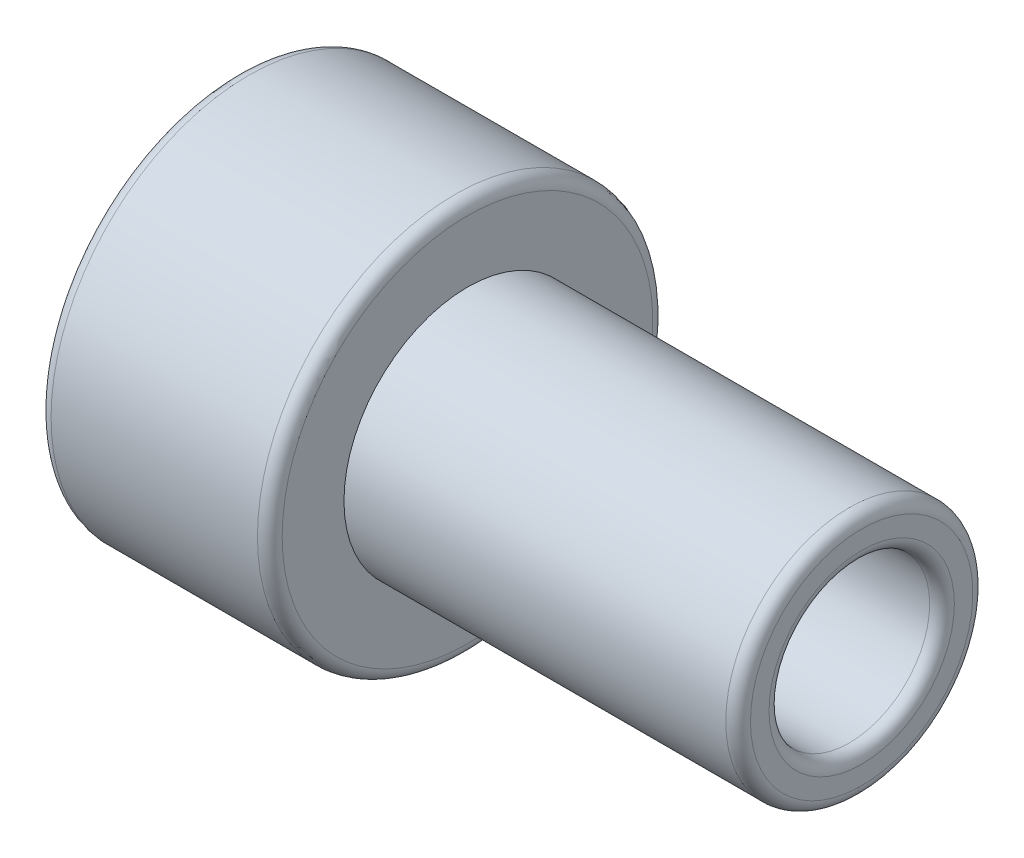
ISO-10303-21;
HEADER;
FILE_DESCRIPTION(('STEP AP214'),'2;1');
FILE_NAME('part.step','',(''),(''),'','','');
FILE_SCHEMA(('AUTOMOTIVE_DESIGN { 1 0 10303 214 1 1 1 1 }'));
ENDSEC;
DATA;
#1=APPLICATION_CONTEXT('core data for automotive mechanical design processes');
#2=APPLICATION_PROTOCOL_DEFINITION('international standard','automotive_design',2000,#1);
#3=PRODUCT_CONTEXT('',#1,'mechanical');
#4=PRODUCT('Part','Part','',(#3));
#5=PRODUCT_RELATED_PRODUCT_CATEGORY('part','',(#4));
#6=PRODUCT_DEFINITION_FORMATION('','',#4);
#7=PRODUCT_DEFINITION_CONTEXT('part definition',#1,'design');
#8=PRODUCT_DEFINITION('design','',#6,#7);
#9=PRODUCT_DEFINITION_SHAPE('','',#8);
#10=(LENGTH_UNIT() NAMED_UNIT(*) SI_UNIT(.MILLI.,.METRE.));
#11=(NAMED_UNIT(*) PLANE_ANGLE_UNIT() SI_UNIT($,.RADIAN.));
#12=(NAMED_UNIT(*) SI_UNIT($,.STERADIAN.) SOLID_ANGLE_UNIT());
#13=UNCERTAINTY_MEASURE_WITH_UNIT(LENGTH_MEASURE(1.E-05),#10,'distance_accuracy_value','');
#14=(GEOMETRIC_REPRESENTATION_CONTEXT(3) GLOBAL_UNCERTAINTY_ASSIGNED_CONTEXT((#13)) GLOBAL_UNIT_ASSIGNED_CONTEXT((#10,
#11,#12)) REPRESENTATION_CONTEXT('',''));
#15=CARTESIAN_POINT('',(0.,0.,0.));
#16=DIRECTION('',(0.,0.,1.));
#17=DIRECTION('',(1.,0.,0.));
#18=AXIS2_PLACEMENT_3D('',#15,#16,#17);
#19=CARTESIAN_POINT('',(11.3,0.,0.));
#20=DIRECTION('',(-1.,0.,0.));
#21=DIRECTION('',(0.,0.,1.));
#22=AXIS2_PLACEMENT_3D('',#19,#20,#21);
#23=PLANE('',#22);
#24=CARTESIAN_POINT('',(11.3,0.,0.));
#25=DIRECTION('',(-1.,0.,0.));
#26=DIRECTION('',(0.,0.,1.));
#27=AXIS2_PLACEMENT_3D('',#24,#25,#26);
#28=CIRCLE('',#27,4.5);
#29=CARTESIAN_POINT('',(11.3,0.,4.5));
#30=VERTEX_POINT('',#29);
#31=EDGE_CURVE('E62',#30,#30,#28,.F.);
#32=ORIENTED_EDGE('',*,*,#31,.T.);
#33=EDGE_LOOP('',(#32));
#34=FACE_BOUND('',#33,.T.);
#35=CARTESIAN_POINT('',(11.3,0.,0.));
#36=DIRECTION('',(-1.,0.,0.));
#37=DIRECTION('',(0.,0.,1.));
#38=AXIS2_PLACEMENT_3D('',#35,#36,#37);
#39=CIRCLE('',#38,3.75);
#40=CARTESIAN_POINT('',(11.3,0.,3.75));
#41=VERTEX_POINT('',#40);
#42=EDGE_CURVE('E65',#41,#41,#39,.T.);
#43=ORIENTED_EDGE('',*,*,#42,.T.);
#44=EDGE_LOOP('',(#43));
#45=FACE_BOUND('',#44,.T.);
#46=ADVANCED_FACE('F33',(#34,#45),#23,.F.);
#47=CARTESIAN_POINT('',(-1.17432348671967,0.,0.));
#48=DIRECTION('',(-1.,0.,0.));
#49=DIRECTION('',(0.,0.,1.));
#50=AXIS2_PLACEMENT_3D('',#47,#48,#49);
#51=CYLINDRICAL_SURFACE('',#50,5.);
#52=CARTESIAN_POINT('',(10.8,0.,0.));
#53=DIRECTION('',(-1.,0.,0.));
#54=DIRECTION('',(0.,0.,1.));
#55=AXIS2_PLACEMENT_3D('',#52,#53,#54);
#56=CIRCLE('',#55,5.);
#57=CARTESIAN_POINT('',(10.8,0.,5.));
#58=VERTEX_POINT('',#57);
#59=EDGE_CURVE('E68',#58,#58,#56,.T.);
#60=ORIENTED_EDGE('',*,*,#59,.T.);
#61=EDGE_LOOP('',(#60));
#62=FACE_BOUND('',#61,.T.);
#63=CARTESIAN_POINT('',(-4.65,0.,0.));
#64=DIRECTION('',(-1.,0.,0.));
#65=DIRECTION('',(0.,0.,1.));
#66=AXIS2_PLACEMENT_3D('',#63,#64,#65);
#67=CIRCLE('',#66,5.);
#68=CARTESIAN_POINT('',(-4.65,0.,5.));
#69=VERTEX_POINT('',#68);
#70=EDGE_CURVE('E71',#69,#69,#67,.T.);
#71=ORIENTED_EDGE('',*,*,#70,.F.);
#72=EDGE_LOOP('',(#71));
#73=FACE_BOUND('',#72,.T.);
#74=ADVANCED_FACE('F77',(#62,#73),#51,.T.);
#75=CARTESIAN_POINT('',(-4.65,0.,0.));
#76=DIRECTION('',(-1.,0.,0.));
#77=DIRECTION('',(0.,0.,1.));
#78=AXIS2_PLACEMENT_3D('',#75,#76,#77);
#79=PLANE('',#78);
#80=CARTESIAN_POINT('',(-4.65,0.,0.));
#81=DIRECTION('',(-1.,0.,0.));
#82=DIRECTION('',(0.,0.,1.));
#83=AXIS2_PLACEMENT_3D('',#80,#81,#82);
#84=CIRCLE('',#83,7.5);
#85=CARTESIAN_POINT('',(-4.65,0.,7.5));
#86=VERTEX_POINT('',#85);
#87=EDGE_CURVE('E44',#86,#86,#84,.F.);
#88=ORIENTED_EDGE('',*,*,#87,.T.);
#89=EDGE_LOOP('',(#88));
#90=FACE_BOUND('',#89,.T.);
#91=ORIENTED_EDGE('',*,*,#70,.T.);
#92=EDGE_LOOP('',(#91));
#93=FACE_BOUND('',#92,.T.);
#94=ADVANCED_FACE('F75',(#90,#93),#79,.F.);
#95=CARTESIAN_POINT('',(-1.17432348671967,0.,0.));
#96=DIRECTION('',(-1.,0.,0.));
#97=DIRECTION('',(0.,0.,1.));
#98=AXIS2_PLACEMENT_3D('',#95,#96,#97);
#99=CYLINDRICAL_SURFACE('',#98,8.);
#100=CARTESIAN_POINT('',(-5.15,0.,0.));
#101=DIRECTION('',(-1.,0.,0.));
#102=DIRECTION('',(0.,0.,1.));
#103=AXIS2_PLACEMENT_3D('',#100,#101,#102);
#104=CIRCLE('',#103,8.);
#105=CARTESIAN_POINT('',(-5.15,0.,8.));
#106=VERTEX_POINT('',#105);
#107=EDGE_CURVE('E48',#106,#106,#104,.T.);
#108=ORIENTED_EDGE('',*,*,#107,.T.);
#109=EDGE_LOOP('',(#108));
#110=FACE_BOUND('',#109,.T.);
#111=CARTESIAN_POINT('',(-13.5,0.,0.));
#112=DIRECTION('',(1.,0.,0.));
#113=DIRECTION('',(0.,0.,-1.));
#114=AXIS2_PLACEMENT_3D('',#111,#112,#113);
#115=CIRCLE('',#114,8.);
#116=CARTESIAN_POINT('',(-13.5,0.,-8.));
#117=VERTEX_POINT('',#116);
#118=EDGE_CURVE('E53',#117,#117,#115,.T.);
#119=ORIENTED_EDGE('',*,*,#118,.T.);
#120=EDGE_LOOP('',(#119));
#121=FACE_BOUND('',#120,.T.);
#122=ADVANCED_FACE('F85',(#110,#121),#99,.T.);
#123=CARTESIAN_POINT('',(-14.,0.,0.));
#124=DIRECTION('',(1.,0.,0.));
#125=DIRECTION('',(0.,0.,-1.));
#126=AXIS2_PLACEMENT_3D('',#123,#124,#125);
#127=PLANE('',#126);
#128=CARTESIAN_POINT('',(-14.,0.,0.));
#129=DIRECTION('',(1.,0.,0.));
#130=DIRECTION('',(0.,0.,-1.));
#131=AXIS2_PLACEMENT_3D('',#128,#129,#130);
#132=CIRCLE('',#131,3.75);
#133=CARTESIAN_POINT('',(-14.,0.,-3.75));
#134=VERTEX_POINT('',#133);
#135=EDGE_CURVE('E10',#134,#134,#132,.T.);
#136=ORIENTED_EDGE('',*,*,#135,.T.);
#137=EDGE_LOOP('',(#136));
#138=FACE_BOUND('',#137,.T.);
#139=CARTESIAN_POINT('',(-14.,0.,0.));
#140=DIRECTION('',(1.,0.,0.));
#141=DIRECTION('',(0.,0.,-1.));
#142=AXIS2_PLACEMENT_3D('',#139,#140,#141);
#143=CIRCLE('',#142,7.5);
#144=CARTESIAN_POINT('',(-14.,0.,-7.5));
#145=VERTEX_POINT('',#144);
#146=EDGE_CURVE('E40',#145,#145,#143,.F.);
#147=ORIENTED_EDGE('',*,*,#146,.T.);
#148=EDGE_LOOP('',(#147));
#149=FACE_BOUND('',#148,.T.);
#150=ADVANCED_FACE('F115',(#138,#149),#127,.F.);
#151=CARTESIAN_POINT('',(-14.,0.,0.));
#152=DIRECTION('',(1.,0.,0.));
#153=DIRECTION('',(0.,0.,-1.));
#154=AXIS2_PLACEMENT_3D('',#151,#152,#153);
#155=CYLINDRICAL_SURFACE('',#154,3.25);
#156=CARTESIAN_POINT('',(10.8,0.,0.));
#157=DIRECTION('',(-1.,0.,0.));
#158=DIRECTION('',(0.,0.,1.));
#159=AXIS2_PLACEMENT_3D('',#156,#157,#158);
#160=CIRCLE('',#159,3.25);
#161=CARTESIAN_POINT('',(10.8,0.,3.25));
#162=VERTEX_POINT('',#161);
#163=EDGE_CURVE('E56',#162,#162,#160,.F.);
#164=ORIENTED_EDGE('',*,*,#163,.T.);
#165=EDGE_LOOP('',(#164));
#166=FACE_BOUND('',#165,.T.);
#167=CARTESIAN_POINT('',(-13.5,0.,0.));
#168=DIRECTION('',(1.,0.,0.));
#169=DIRECTION('',(0.,0.,-1.));
#170=AXIS2_PLACEMENT_3D('',#167,#168,#169);
#171=CIRCLE('',#170,3.25);
#172=CARTESIAN_POINT('',(-13.5,0.,-3.25));
#173=VERTEX_POINT('',#172);
#174=EDGE_CURVE('E59',#173,#173,#171,.F.);
#175=ORIENTED_EDGE('',*,*,#174,.T.);
#176=EDGE_LOOP('',(#175));
#177=FACE_BOUND('',#176,.T.);
#178=ADVANCED_FACE('F96',(#166,#177),#155,.F.);
#179=CARTESIAN_POINT('',(10.8,0.,0.));
#180=DIRECTION('',(-1.,0.,0.));
#181=DIRECTION('',(0.,0.,1.));
#182=AXIS2_PLACEMENT_3D('',#179,#180,#181);
#183=TOROIDAL_SURFACE('',#182,4.5,0.5);
#184=ORIENTED_EDGE('',*,*,#31,.F.);
#185=EDGE_LOOP('',(#184));
#186=FACE_BOUND('',#185,.T.);
#187=ORIENTED_EDGE('',*,*,#59,.F.);
#188=EDGE_LOOP('',(#187));
#189=FACE_BOUND('',#188,.T.);
#190=ADVANCED_FACE('F92',(#186,#189),#183,.T.);
#191=CARTESIAN_POINT('',(10.8,0.,0.));
#192=DIRECTION('',(-1.,0.,0.));
#193=DIRECTION('',(0.,0.,1.));
#194=AXIS2_PLACEMENT_3D('',#191,#192,#193);
#195=TOROIDAL_SURFACE('',#194,3.75,0.5);
#196=ORIENTED_EDGE('',*,*,#42,.F.);
#197=EDGE_LOOP('',(#196));
#198=FACE_BOUND('',#197,.T.);
#199=ORIENTED_EDGE('',*,*,#163,.F.);
#200=EDGE_LOOP('',(#199));
#201=FACE_BOUND('',#200,.T.);
#202=ADVANCED_FACE('F95',(#198,#201),#195,.T.);
#203=CARTESIAN_POINT('',(-5.15,0.,0.));
#204=DIRECTION('',(-1.,0.,0.));
#205=DIRECTION('',(0.,0.,1.));
#206=AXIS2_PLACEMENT_3D('',#203,#204,#205);
#207=TOROIDAL_SURFACE('',#206,7.5,0.5);
#208=ORIENTED_EDGE('',*,*,#87,.F.);
#209=EDGE_LOOP('',(#208));
#210=FACE_BOUND('',#209,.T.);
#211=ORIENTED_EDGE('',*,*,#107,.F.);
#212=EDGE_LOOP('',(#211));
#213=FACE_BOUND('',#212,.T.);
#214=ADVANCED_FACE('F100',(#210,#213),#207,.T.);
#215=CARTESIAN_POINT('',(-13.5,0.,0.));
#216=DIRECTION('',(1.,0.,0.));
#217=DIRECTION('',(0.,0.,-1.));
#218=AXIS2_PLACEMENT_3D('',#215,#216,#217);
#219=TOROIDAL_SURFACE('',#218,3.75,0.5);
#220=ORIENTED_EDGE('',*,*,#174,.F.);
#221=EDGE_LOOP('',(#220));
#222=FACE_BOUND('',#221,.T.);
#223=ORIENTED_EDGE('',*,*,#135,.F.);
#224=EDGE_LOOP('',(#223));
#225=FACE_BOUND('',#224,.T.);
#226=ADVANCED_FACE('F103',(#222,#225),#219,.T.);
#227=CARTESIAN_POINT('',(-13.5,0.,0.));
#228=DIRECTION('',(1.,0.,0.));
#229=DIRECTION('',(0.,0.,-1.));
#230=AXIS2_PLACEMENT_3D('',#227,#228,#229);
#231=TOROIDAL_SURFACE('',#230,7.5,0.5);
#232=ORIENTED_EDGE('',*,*,#118,.F.);
#233=EDGE_LOOP('',(#232));
#234=FACE_BOUND('',#233,.T.);
#235=ORIENTED_EDGE('',*,*,#146,.F.);
#236=EDGE_LOOP('',(#235));
#237=FACE_BOUND('',#236,.T.);
#238=ADVANCED_FACE('F35',(#234,#237),#231,.T.);
#239=CLOSED_SHELL('',(#46,#74,#94,#122,#150,#178,#190,#202,#214,#226,#238));
#240=MANIFOLD_SOLID_BREP('B2',#239);
#241=ADVANCED_BREP_SHAPE_REPRESENTATION('',(#18,#240),#14);
#242=SHAPE_DEFINITION_REPRESENTATION(#9,#241);
ENDSEC;
END-ISO-10303-21;
